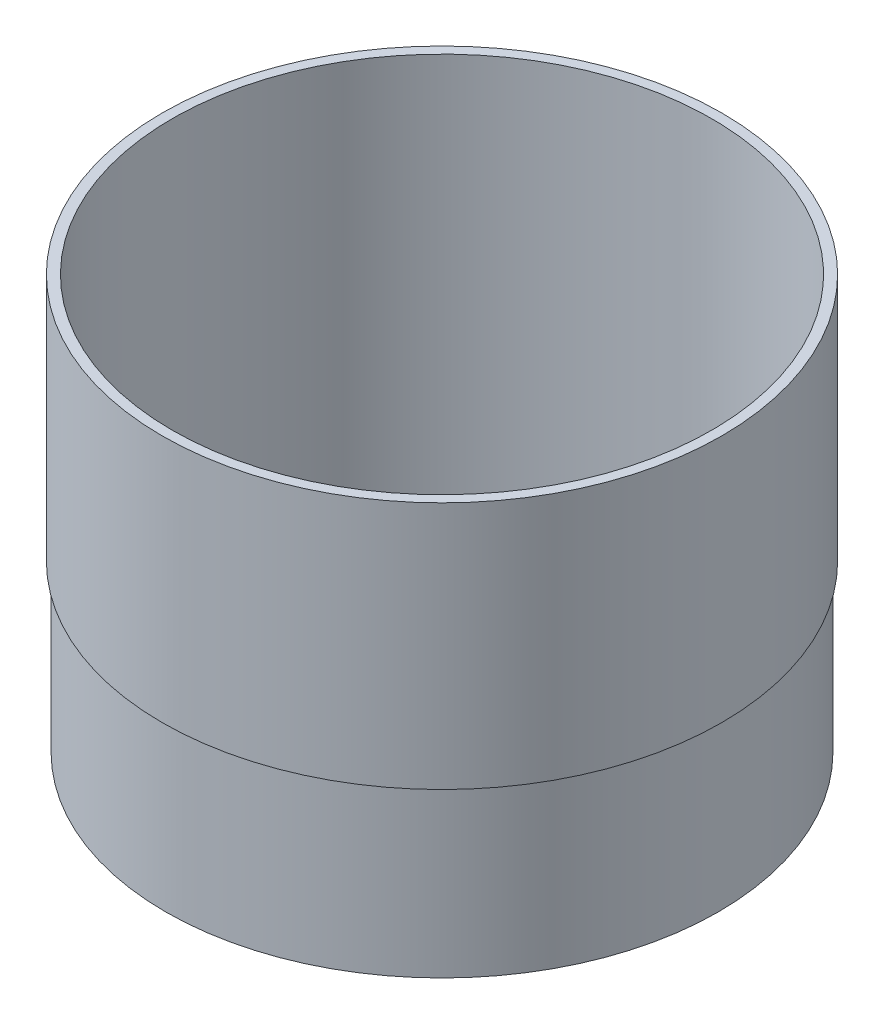
ISO-10303-21;
HEADER;
FILE_DESCRIPTION(('STEP AP214'),'2;1');
FILE_NAME('part.step','',(''),(''),'','','');
FILE_SCHEMA(('AUTOMOTIVE_DESIGN { 1 0 10303 214 1 1 1 1 }'));
ENDSEC;
DATA;
#1=APPLICATION_CONTEXT('core data for automotive mechanical design processes');
#2=APPLICATION_PROTOCOL_DEFINITION('international standard','automotive_design',2000,#1);
#3=PRODUCT_CONTEXT('',#1,'mechanical');
#4=PRODUCT('Part','Part','',(#3));
#5=PRODUCT_RELATED_PRODUCT_CATEGORY('part','',(#4));
#6=PRODUCT_DEFINITION_FORMATION('','',#4);
#7=PRODUCT_DEFINITION_CONTEXT('part definition',#1,'design');
#8=PRODUCT_DEFINITION('design','',#6,#7);
#9=PRODUCT_DEFINITION_SHAPE('','',#8);
#10=(LENGTH_UNIT() NAMED_UNIT(*) SI_UNIT(.MILLI.,.METRE.));
#11=(NAMED_UNIT(*) PLANE_ANGLE_UNIT() SI_UNIT($,.RADIAN.));
#12=(NAMED_UNIT(*) SI_UNIT($,.STERADIAN.) SOLID_ANGLE_UNIT());
#13=UNCERTAINTY_MEASURE_WITH_UNIT(LENGTH_MEASURE(1.E-05),#10,'distance_accuracy_value','');
#14=(GEOMETRIC_REPRESENTATION_CONTEXT(3) GLOBAL_UNCERTAINTY_ASSIGNED_CONTEXT((#13)) GLOBAL_UNIT_ASSIGNED_CONTEXT((#10,
#11,#12)) REPRESENTATION_CONTEXT('',''));
#15=CARTESIAN_POINT('',(0.,0.,0.));
#16=DIRECTION('',(0.,0.,1.));
#17=DIRECTION('',(1.,0.,0.));
#18=AXIS2_PLACEMENT_3D('',#15,#16,#17);
#19=CARTESIAN_POINT('',(0.,0.,0.));
#20=DIRECTION('',(0.,1.,0.));
#21=DIRECTION('',(0.,0.,1.));
#22=AXIS2_PLACEMENT_3D('',#19,#20,#21);
#23=PLANE('',#22);
#24=CARTESIAN_POINT('',(0.,0.,0.));
#25=DIRECTION('',(0.,1.,0.));
#26=DIRECTION('',(0.,0.,1.));
#27=AXIS2_PLACEMENT_3D('',#24,#25,#26);
#28=CIRCLE('',#27,16.7);
#29=CARTESIAN_POINT('',(0.,0.,16.7));
#30=VERTEX_POINT('',#29);
#31=EDGE_CURVE('E41',#30,#30,#28,.T.);
#32=ORIENTED_EDGE('',*,*,#31,.F.);
#33=EDGE_LOOP('',(#32));
#34=FACE_BOUND('',#33,.T.);
#35=CARTESIAN_POINT('',(0.,0.,0.));
#36=DIRECTION('',(0.,1.,0.));
#37=DIRECTION('',(0.,0.,1.));
#38=AXIS2_PLACEMENT_3D('',#35,#36,#37);
#39=CIRCLE('',#38,16.3);
#40=CARTESIAN_POINT('',(0.,0.,16.3));
#41=VERTEX_POINT('',#40);
#42=EDGE_CURVE('E50',#41,#41,#39,.T.);
#43=ORIENTED_EDGE('',*,*,#42,.T.);
#44=EDGE_LOOP('',(#43));
#45=FACE_BOUND('',#44,.T.);
#46=ADVANCED_FACE('F37',(#34,#45),#23,.F.);
#47=CARTESIAN_POINT('',(0.,10.,0.));
#48=DIRECTION('',(0.,-1.,0.));
#49=DIRECTION('',(0.,0.,-1.));
#50=AXIS2_PLACEMENT_3D('',#47,#48,#49);
#51=CYLINDRICAL_SURFACE('',#50,16.7);
#52=CARTESIAN_POINT('',(0.,10.,0.));
#53=DIRECTION('',(0.,1.,0.));
#54=DIRECTION('',(0.,0.,1.));
#55=AXIS2_PLACEMENT_3D('',#52,#53,#54);
#56=CIRCLE('',#55,16.7);
#57=CARTESIAN_POINT('',(0.,10.,16.7));
#58=VERTEX_POINT('',#57);
#59=EDGE_CURVE('E10',#58,#58,#56,.T.);
#60=ORIENTED_EDGE('',*,*,#59,.F.);
#61=EDGE_LOOP('',(#60));
#62=FACE_BOUND('',#61,.T.);
#63=ORIENTED_EDGE('',*,*,#31,.T.);
#64=EDGE_LOOP('',(#63));
#65=FACE_BOUND('',#64,.T.);
#66=ADVANCED_FACE('F39',(#62,#65),#51,.T.);
#67=CARTESIAN_POINT('',(0.,10.,0.));
#68=DIRECTION('',(0.,-1.,0.));
#69=DIRECTION('',(0.,0.,-1.));
#70=AXIS2_PLACEMENT_3D('',#67,#68,#69);
#71=CYLINDRICAL_SURFACE('',#70,16.3);
#72=ORIENTED_EDGE('',*,*,#42,.F.);
#73=EDGE_LOOP('',(#72));
#74=FACE_BOUND('',#73,.T.);
#75=CARTESIAN_POINT('',(0.,25.,0.));
#76=DIRECTION('',(0.,1.,0.));
#77=DIRECTION('',(0.,0.,1.));
#78=AXIS2_PLACEMENT_3D('',#75,#76,#77);
#79=CIRCLE('',#78,16.3);
#80=CARTESIAN_POINT('',(0.,25.,16.3));
#81=VERTEX_POINT('',#80);
#82=EDGE_CURVE('E60',#81,#81,#79,.T.);
#83=ORIENTED_EDGE('',*,*,#82,.T.);
#84=EDGE_LOOP('',(#83));
#85=FACE_BOUND('',#84,.T.);
#86=ADVANCED_FACE('F68',(#74,#85),#71,.F.);
#87=CARTESIAN_POINT('',(0.,25.,0.));
#88=DIRECTION('',(0.,1.,0.));
#89=DIRECTION('',(0.,0.,1.));
#90=AXIS2_PLACEMENT_3D('',#87,#88,#89);
#91=PLANE('',#90);
#92=CARTESIAN_POINT('',(0.,25.,0.));
#93=DIRECTION('',(0.,1.,0.));
#94=DIRECTION('',(0.,0.,1.));
#95=AXIS2_PLACEMENT_3D('',#92,#93,#94);
#96=CIRCLE('',#95,16.9);
#97=CARTESIAN_POINT('',(0.,25.,16.9));
#98=VERTEX_POINT('',#97);
#99=EDGE_CURVE('E55',#98,#98,#96,.T.);
#100=ORIENTED_EDGE('',*,*,#99,.T.);
#101=EDGE_LOOP('',(#100));
#102=FACE_BOUND('',#101,.T.);
#103=ORIENTED_EDGE('',*,*,#82,.F.);
#104=EDGE_LOOP('',(#103));
#105=FACE_BOUND('',#104,.T.);
#106=ADVANCED_FACE('F70',(#102,#105),#91,.T.);
#107=CARTESIAN_POINT('',(0.,10.,0.));
#108=DIRECTION('',(0.,1.,0.));
#109=DIRECTION('',(0.,0.,1.));
#110=AXIS2_PLACEMENT_3D('',#107,#108,#109);
#111=PLANE('',#110);
#112=ORIENTED_EDGE('',*,*,#59,.T.);
#113=EDGE_LOOP('',(#112));
#114=FACE_BOUND('',#113,.T.);
#115=CARTESIAN_POINT('',(0.,10.,0.));
#116=DIRECTION('',(0.,1.,0.));
#117=DIRECTION('',(0.,0.,1.));
#118=AXIS2_PLACEMENT_3D('',#115,#116,#117);
#119=CIRCLE('',#118,16.9);
#120=CARTESIAN_POINT('',(0.,10.,16.9));
#121=VERTEX_POINT('',#120);
#122=EDGE_CURVE('E56',#121,#121,#119,.T.);
#123=ORIENTED_EDGE('',*,*,#122,.F.);
#124=EDGE_LOOP('',(#123));
#125=FACE_BOUND('',#124,.T.);
#126=ADVANCED_FACE('F72',(#114,#125),#111,.F.);
#127=CARTESIAN_POINT('',(0.,25.,0.));
#128=DIRECTION('',(0.,-1.,0.));
#129=DIRECTION('',(0.,0.,-1.));
#130=AXIS2_PLACEMENT_3D('',#127,#128,#129);
#131=CYLINDRICAL_SURFACE('',#130,16.9);
#132=ORIENTED_EDGE('',*,*,#99,.F.);
#133=EDGE_LOOP('',(#132));
#134=FACE_BOUND('',#133,.T.);
#135=ORIENTED_EDGE('',*,*,#122,.T.);
#136=EDGE_LOOP('',(#135));
#137=FACE_BOUND('',#136,.T.);
#138=ADVANCED_FACE('F79',(#134,#137),#131,.T.);
#139=CLOSED_SHELL('',(#46,#66,#86,#106,#126,#138));
#140=MANIFOLD_SOLID_BREP('B2',#139);
#141=ADVANCED_BREP_SHAPE_REPRESENTATION('',(#18,#140),#14);
#142=SHAPE_DEFINITION_REPRESENTATION(#9,#141);
ENDSEC;
END-ISO-10303-21;
